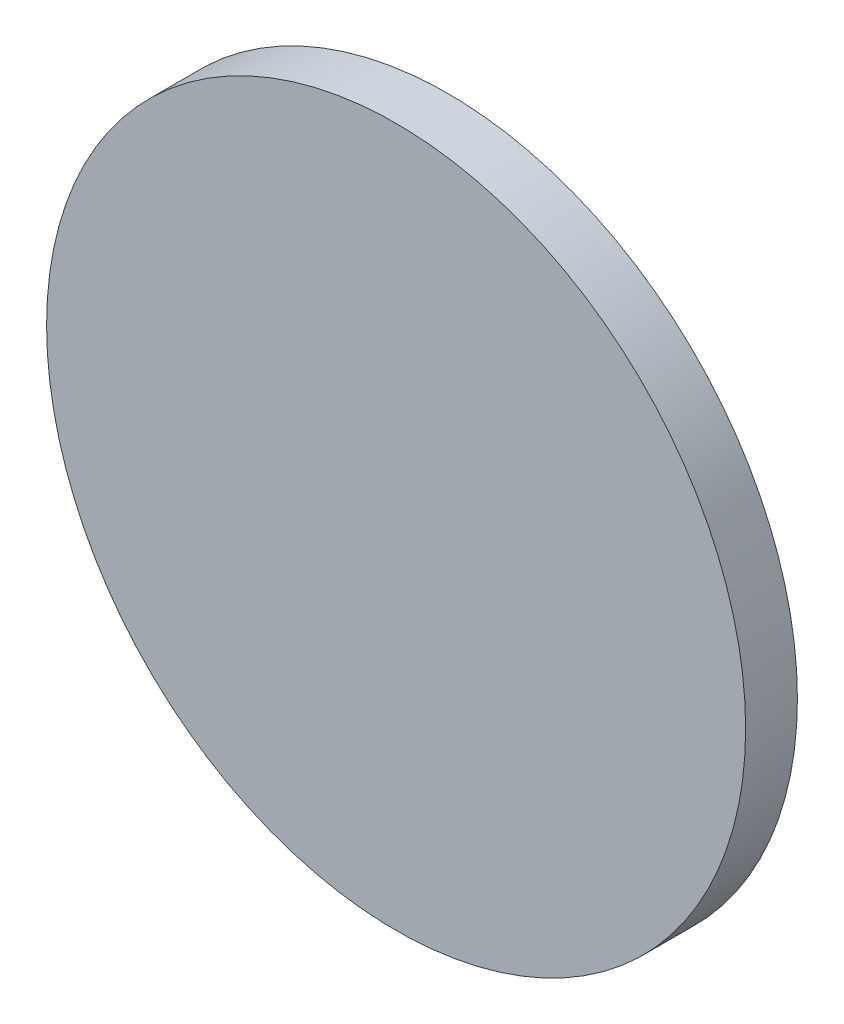
ISO-10303-21;
HEADER;
FILE_DESCRIPTION(('STEP AP214'),'2;1');
FILE_NAME('part.step','',(''),(''),'','','');
FILE_SCHEMA(('AUTOMOTIVE_DESIGN { 1 0 10303 214 1 1 1 1 }'));
ENDSEC;
DATA;
#1=APPLICATION_CONTEXT('core data for automotive mechanical design processes');
#2=APPLICATION_PROTOCOL_DEFINITION('international standard','automotive_design',2000,#1);
#3=PRODUCT_CONTEXT('',#1,'mechanical');
#4=PRODUCT('Part','Part','',(#3));
#5=PRODUCT_RELATED_PRODUCT_CATEGORY('part','',(#4));
#6=PRODUCT_DEFINITION_FORMATION('','',#4);
#7=PRODUCT_DEFINITION_CONTEXT('part definition',#1,'design');
#8=PRODUCT_DEFINITION('design','',#6,#7);
#9=PRODUCT_DEFINITION_SHAPE('','',#8);
#10=(LENGTH_UNIT() NAMED_UNIT(*) SI_UNIT(.MILLI.,.METRE.));
#11=(NAMED_UNIT(*) PLANE_ANGLE_UNIT() SI_UNIT($,.RADIAN.));
#12=(NAMED_UNIT(*) SI_UNIT($,.STERADIAN.) SOLID_ANGLE_UNIT());
#13=UNCERTAINTY_MEASURE_WITH_UNIT(LENGTH_MEASURE(1.E-05),#10,'distance_accuracy_value','');
#14=(GEOMETRIC_REPRESENTATION_CONTEXT(3) GLOBAL_UNCERTAINTY_ASSIGNED_CONTEXT((#13)) GLOBAL_UNIT_ASSIGNED_CONTEXT((#10,
#11,#12)) REPRESENTATION_CONTEXT('',''));
#15=CARTESIAN_POINT('',(0.,0.,0.));
#16=DIRECTION('',(0.,0.,1.));
#17=DIRECTION('',(1.,0.,0.));
#18=AXIS2_PLACEMENT_3D('',#15,#16,#17);
#19=CARTESIAN_POINT('',(0.,0.,4.));
#20=DIRECTION('',(0.,0.,-1.));
#21=DIRECTION('',(-1.,0.,0.));
#22=AXIS2_PLACEMENT_3D('',#19,#20,#21);
#23=CYLINDRICAL_SURFACE('',#22,27.);
#24=CARTESIAN_POINT('',(0.,0.,4.));
#25=DIRECTION('',(0.,0.,1.));
#26=DIRECTION('',(1.,0.,0.));
#27=AXIS2_PLACEMENT_3D('',#24,#25,#26);
#28=CIRCLE('',#27,27.);
#29=CARTESIAN_POINT('',(27.,0.,4.));
#30=VERTEX_POINT('',#29);
#31=EDGE_CURVE('E10',#30,#30,#28,.T.);
#32=ORIENTED_EDGE('',*,*,#31,.F.);
#33=EDGE_LOOP('',(#32));
#34=FACE_BOUND('',#33,.T.);
#35=CARTESIAN_POINT('',(0.,0.,0.));
#36=DIRECTION('',(0.,0.,1.));
#37=DIRECTION('',(1.,0.,0.));
#38=AXIS2_PLACEMENT_3D('',#35,#36,#37);
#39=CIRCLE('',#38,27.);
#40=CARTESIAN_POINT('',(27.,0.,0.));
#41=VERTEX_POINT('',#40);
#42=EDGE_CURVE('E40',#41,#41,#39,.T.);
#43=ORIENTED_EDGE('',*,*,#42,.T.);
#44=EDGE_LOOP('',(#43));
#45=FACE_BOUND('',#44,.T.);
#46=ADVANCED_FACE('F37',(#34,#45),#23,.T.);
#47=CARTESIAN_POINT('',(0.,0.,4.));
#48=DIRECTION('',(0.,0.,1.));
#49=DIRECTION('',(1.,0.,0.));
#50=AXIS2_PLACEMENT_3D('',#47,#48,#49);
#51=PLANE('',#50);
#52=ORIENTED_EDGE('',*,*,#31,.T.);
#53=EDGE_LOOP('',(#52));
#54=FACE_BOUND('',#53,.T.);
#55=ADVANCED_FACE('F52',(#54),#51,.T.);
#56=CARTESIAN_POINT('',(0.,0.,0.));
#57=DIRECTION('',(0.,0.,1.));
#58=DIRECTION('',(1.,0.,0.));
#59=AXIS2_PLACEMENT_3D('',#56,#57,#58);
#60=PLANE('',#59);
#61=ORIENTED_EDGE('',*,*,#42,.F.);
#62=EDGE_LOOP('',(#61));
#63=FACE_BOUND('',#62,.T.);
#64=ADVANCED_FACE('F50',(#63),#60,.F.);
#65=CLOSED_SHELL('',(#46,#55,#64));
#66=MANIFOLD_SOLID_BREP('B2',#65);
#67=ADVANCED_BREP_SHAPE_REPRESENTATION('',(#18,#66),#14);
#68=SHAPE_DEFINITION_REPRESENTATION(#9,#67);
ENDSEC;
END-ISO-10303-21;
